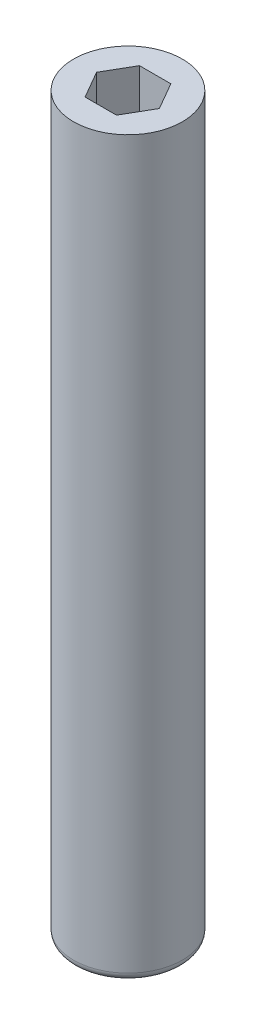
ISO-10303-21;
HEADER;
FILE_DESCRIPTION(('STEP AP214'),'2;1');
FILE_NAME('part.step','',(''),(''),'','','');
FILE_SCHEMA(('AUTOMOTIVE_DESIGN { 1 0 10303 214 1 1 1 1 }'));
ENDSEC;
DATA;
#1=APPLICATION_CONTEXT('core data for automotive mechanical design processes');
#2=APPLICATION_PROTOCOL_DEFINITION('international standard','automotive_design',2000,#1);
#3=PRODUCT_CONTEXT('',#1,'mechanical');
#4=PRODUCT('Part','Part','',(#3));
#5=PRODUCT_RELATED_PRODUCT_CATEGORY('part','',(#4));
#6=PRODUCT_DEFINITION_FORMATION('','',#4);
#7=PRODUCT_DEFINITION_CONTEXT('part definition',#1,'design');
#8=PRODUCT_DEFINITION('design','',#6,#7);
#9=PRODUCT_DEFINITION_SHAPE('','',#8);
#10=(LENGTH_UNIT() NAMED_UNIT(*) SI_UNIT(.MILLI.,.METRE.));
#11=(NAMED_UNIT(*) PLANE_ANGLE_UNIT() SI_UNIT($,.RADIAN.));
#12=(NAMED_UNIT(*) SI_UNIT($,.STERADIAN.) SOLID_ANGLE_UNIT());
#13=UNCERTAINTY_MEASURE_WITH_UNIT(LENGTH_MEASURE(1.E-05),#10,'distance_accuracy_value','');
#14=(GEOMETRIC_REPRESENTATION_CONTEXT(3) GLOBAL_UNCERTAINTY_ASSIGNED_CONTEXT((#13)) GLOBAL_UNIT_ASSIGNED_CONTEXT((#10,
#11,#12)) REPRESENTATION_CONTEXT('',''));
#15=CARTESIAN_POINT('',(0.,0.,0.));
#16=DIRECTION('',(0.,0.,1.));
#17=DIRECTION('',(1.,0.,0.));
#18=AXIS2_PLACEMENT_3D('',#15,#16,#17);
#19=CARTESIAN_POINT('',(0.,68.58,0.));
#20=DIRECTION('',(0.,-1.,0.));
#21=DIRECTION('',(0.,0.,-1.));
#22=AXIS2_PLACEMENT_3D('',#19,#20,#21);
#23=CYLINDRICAL_SURFACE('',#22,5.08);
#24=CARTESIAN_POINT('',(0.,0.761999999999999,0.));
#25=DIRECTION('',(0.,1.,0.));
#26=DIRECTION('',(0.,0.,1.));
#27=AXIS2_PLACEMENT_3D('',#24,#25,#26);
#28=CIRCLE('',#27,5.08);
#29=CARTESIAN_POINT('',(0.,0.761999999999999,5.08));
#30=VERTEX_POINT('',#29);
#31=EDGE_CURVE('E40',#30,#30,#28,.T.);
#32=ORIENTED_EDGE('',*,*,#31,.T.);
#33=EDGE_LOOP('',(#32));
#34=FACE_BOUND('',#33,.T.);
#35=CARTESIAN_POINT('',(0.,68.58,0.));
#36=DIRECTION('',(0.,1.,0.));
#37=DIRECTION('',(0.,0.,1.));
#38=AXIS2_PLACEMENT_3D('',#35,#36,#37);
#39=CIRCLE('',#38,5.08);
#40=CARTESIAN_POINT('',(0.,68.58,5.08));
#41=VERTEX_POINT('',#40);
#42=EDGE_CURVE('E134',#41,#41,#39,.T.);
#43=ORIENTED_EDGE('',*,*,#42,.F.);
#44=EDGE_LOOP('',(#43));
#45=FACE_BOUND('',#44,.T.);
#46=ADVANCED_FACE('F32',(#34,#45),#23,.T.);
#47=CARTESIAN_POINT('',(0.,68.58,0.));
#48=DIRECTION('',(0.,1.,0.));
#49=DIRECTION('',(0.,0.,1.));
#50=AXIS2_PLACEMENT_3D('',#47,#48,#49);
#51=PLANE('',#50);
#52=DIRECTION('',(0.5,0.,0.866025403784439));
#53=VECTOR('',#52,1.);
#54=CARTESIAN_POINT('',(-2.9329393674833,68.58,0.));
#55=LINE('',#54,#53);
#56=CARTESIAN_POINT('',(-2.9329393674833,68.58,0.));
#57=VERTEX_POINT('',#56);
#58=CARTESIAN_POINT('',(-1.46646968374165,68.58,2.54));
#59=VERTEX_POINT('',#58);
#60=EDGE_CURVE('E47',#57,#59,#55,.T.);
#61=ORIENTED_EDGE('',*,*,#60,.F.);
#62=DIRECTION('',(-0.5,0.,0.866025403784439));
#63=VECTOR('',#62,1.);
#64=CARTESIAN_POINT('',(-1.46646968374165,68.58,-2.54));
#65=LINE('',#64,#63);
#66=CARTESIAN_POINT('',(-1.46646968374165,68.58,-2.54));
#67=VERTEX_POINT('',#66);
#68=EDGE_CURVE('E130',#67,#57,#65,.T.);
#69=ORIENTED_EDGE('',*,*,#68,.F.);
#70=DIRECTION('',(-1.,0.,0.));
#71=VECTOR('',#70,1.);
#72=CARTESIAN_POINT('',(1.46646968374165,68.58,-2.54));
#73=LINE('',#72,#71);
#74=CARTESIAN_POINT('',(1.46646968374165,68.58,-2.54));
#75=VERTEX_POINT('',#74);
#76=EDGE_CURVE('E128',#75,#67,#73,.T.);
#77=ORIENTED_EDGE('',*,*,#76,.F.);
#78=DIRECTION('',(-0.5,0.,-0.866025403784439));
#79=VECTOR('',#78,1.);
#80=CARTESIAN_POINT('',(2.9329393674833,68.58,0.));
#81=LINE('',#80,#79);
#82=CARTESIAN_POINT('',(2.9329393674833,68.58,0.));
#83=VERTEX_POINT('',#82);
#84=EDGE_CURVE('E95',#83,#75,#81,.T.);
#85=ORIENTED_EDGE('',*,*,#84,.F.);
#86=DIRECTION('',(0.5,0.,-0.866025403784438));
#87=VECTOR('',#86,1.);
#88=CARTESIAN_POINT('',(1.46646968374165,68.58,2.54));
#89=LINE('',#88,#87);
#90=CARTESIAN_POINT('',(1.46646968374165,68.58,2.54));
#91=VERTEX_POINT('',#90);
#92=EDGE_CURVE('E124',#91,#83,#89,.T.);
#93=ORIENTED_EDGE('',*,*,#92,.F.);
#94=DIRECTION('',(1.,0.,0.));
#95=VECTOR('',#94,1.);
#96=CARTESIAN_POINT('',(-1.46646968374165,68.58,2.54));
#97=LINE('',#96,#95);
#98=EDGE_CURVE('E121',#59,#91,#97,.T.);
#99=ORIENTED_EDGE('',*,*,#98,.F.);
#100=EDGE_LOOP('',(#61,#69,#77,#85,#93,#99));
#101=FACE_BOUND('',#100,.T.);
#102=ORIENTED_EDGE('',*,*,#42,.T.);
#103=EDGE_LOOP('',(#102));
#104=FACE_BOUND('',#103,.T.);
#105=ADVANCED_FACE('F155',(#101,#104),#51,.T.);
#106=CARTESIAN_POINT('',(0.,0.,0.));
#107=DIRECTION('',(0.,1.,0.));
#108=DIRECTION('',(0.,0.,1.));
#109=AXIS2_PLACEMENT_3D('',#106,#107,#108);
#110=PLANE('',#109);
#111=CARTESIAN_POINT('',(0.,0.,0.));
#112=DIRECTION('',(0.,1.,0.));
#113=DIRECTION('',(0.,0.,1.));
#114=AXIS2_PLACEMENT_3D('',#111,#112,#113);
#115=CIRCLE('',#114,4.318);
#116=CARTESIAN_POINT('',(0.,0.,4.318));
#117=VERTEX_POINT('',#116);
#118=EDGE_CURVE('E11',#117,#117,#115,.F.);
#119=ORIENTED_EDGE('',*,*,#118,.T.);
#120=EDGE_LOOP('',(#119));
#121=FACE_BOUND('',#120,.T.);
#122=ADVANCED_FACE('F159',(#121),#110,.F.);
#123=CARTESIAN_POINT('',(-2.9329393674833,63.5,0.));
#124=DIRECTION('',(-0.866025403784439,0.,0.5));
#125=DIRECTION('',(0.5,0.,0.866025403784439));
#126=AXIS2_PLACEMENT_3D('',#123,#124,#125);
#127=PLANE('',#126);
#128=ORIENTED_EDGE('',*,*,#60,.T.);
#129=DIRECTION('',(0.,1.,0.));
#130=VECTOR('',#129,1.);
#131=CARTESIAN_POINT('',(-1.46646968374165,63.5,2.54));
#132=LINE('',#131,#130);
#133=CARTESIAN_POINT('',(-1.46646968374165,63.5,2.54));
#134=VERTEX_POINT('',#133);
#135=EDGE_CURVE('E77',#134,#59,#132,.T.);
#136=ORIENTED_EDGE('',*,*,#135,.F.);
#137=DIRECTION('',(0.5,0.,0.866025403784439));
#138=VECTOR('',#137,1.);
#139=CARTESIAN_POINT('',(-2.9329393674833,63.5,0.));
#140=LINE('',#139,#138);
#141=CARTESIAN_POINT('',(-2.9329393674833,63.5,0.));
#142=VERTEX_POINT('',#141);
#143=EDGE_CURVE('E132',#142,#134,#140,.T.);
#144=ORIENTED_EDGE('',*,*,#143,.F.);
#145=DIRECTION('',(0.,1.,0.));
#146=VECTOR('',#145,1.);
#147=CARTESIAN_POINT('',(-2.9329393674833,63.5,0.));
#148=LINE('',#147,#146);
#149=EDGE_CURVE('E55',#142,#57,#148,.T.);
#150=ORIENTED_EDGE('',*,*,#149,.T.);
#151=EDGE_LOOP('',(#128,#136,#144,#150));
#152=FACE_BOUND('',#151,.T.);
#153=ADVANCED_FACE('F164',(#152),#127,.F.);
#154=CARTESIAN_POINT('',(-1.46646968374165,63.5,-2.54));
#155=DIRECTION('',(-0.866025403784438,0.,-0.5));
#156=DIRECTION('',(-0.5,0.,0.866025403784439));
#157=AXIS2_PLACEMENT_3D('',#154,#155,#156);
#158=PLANE('',#157);
#159=ORIENTED_EDGE('',*,*,#68,.T.);
#160=ORIENTED_EDGE('',*,*,#149,.F.);
#161=DIRECTION('',(-0.5,0.,0.866025403784439));
#162=VECTOR('',#161,1.);
#163=CARTESIAN_POINT('',(-1.46646968374165,63.5,-2.54));
#164=LINE('',#163,#162);
#165=CARTESIAN_POINT('',(-1.46646968374165,63.5,-2.54));
#166=VERTEX_POINT('',#165);
#167=EDGE_CURVE('E107',#166,#142,#164,.T.);
#168=ORIENTED_EDGE('',*,*,#167,.F.);
#169=DIRECTION('',(0.,1.,0.));
#170=VECTOR('',#169,1.);
#171=CARTESIAN_POINT('',(-1.46646968374165,63.5,-2.54));
#172=LINE('',#171,#170);
#173=EDGE_CURVE('E99',#166,#67,#172,.T.);
#174=ORIENTED_EDGE('',*,*,#173,.T.);
#175=EDGE_LOOP('',(#159,#160,#168,#174));
#176=FACE_BOUND('',#175,.T.);
#177=ADVANCED_FACE('F169',(#176),#158,.F.);
#178=CARTESIAN_POINT('',(1.46646968374165,63.5,-2.54));
#179=DIRECTION('',(0.,0.,-1.));
#180=DIRECTION('',(-1.,0.,0.));
#181=AXIS2_PLACEMENT_3D('',#178,#179,#180);
#182=PLANE('',#181);
#183=ORIENTED_EDGE('',*,*,#76,.T.);
#184=ORIENTED_EDGE('',*,*,#173,.F.);
#185=DIRECTION('',(-1.,0.,0.));
#186=VECTOR('',#185,1.);
#187=CARTESIAN_POINT('',(1.46646968374165,63.5,-2.54));
#188=LINE('',#187,#186);
#189=CARTESIAN_POINT('',(1.46646968374165,63.5,-2.54));
#190=VERTEX_POINT('',#189);
#191=EDGE_CURVE('E103',#190,#166,#188,.T.);
#192=ORIENTED_EDGE('',*,*,#191,.F.);
#193=DIRECTION('',(0.,1.,0.));
#194=VECTOR('',#193,1.);
#195=CARTESIAN_POINT('',(1.46646968374165,63.5,-2.54));
#196=LINE('',#195,#194);
#197=EDGE_CURVE('E88',#190,#75,#196,.T.);
#198=ORIENTED_EDGE('',*,*,#197,.T.);
#199=EDGE_LOOP('',(#183,#184,#192,#198));
#200=FACE_BOUND('',#199,.T.);
#201=ADVANCED_FACE('F104',(#200),#182,.F.);
#202=CARTESIAN_POINT('',(2.9329393674833,63.5,0.));
#203=DIRECTION('',(0.866025403784439,0.,-0.5));
#204=DIRECTION('',(-0.5,0.,-0.866025403784439));
#205=AXIS2_PLACEMENT_3D('',#202,#203,#204);
#206=PLANE('',#205);
#207=ORIENTED_EDGE('',*,*,#84,.T.);
#208=ORIENTED_EDGE('',*,*,#197,.F.);
#209=DIRECTION('',(-0.5,0.,-0.866025403784439));
#210=VECTOR('',#209,1.);
#211=CARTESIAN_POINT('',(2.9329393674833,63.5,0.));
#212=LINE('',#211,#210);
#213=CARTESIAN_POINT('',(2.9329393674833,63.5,0.));
#214=VERTEX_POINT('',#213);
#215=EDGE_CURVE('E92',#214,#190,#212,.T.);
#216=ORIENTED_EDGE('',*,*,#215,.F.);
#217=DIRECTION('',(0.,1.,0.));
#218=VECTOR('',#217,1.);
#219=CARTESIAN_POINT('',(2.9329393674833,63.5,0.));
#220=LINE('',#219,#218);
#221=EDGE_CURVE('E100',#214,#83,#220,.T.);
#222=ORIENTED_EDGE('',*,*,#221,.T.);
#223=EDGE_LOOP('',(#207,#208,#216,#222));
#224=FACE_BOUND('',#223,.T.);
#225=ADVANCED_FACE('F90',(#224),#206,.F.);
#226=CARTESIAN_POINT('',(1.46646968374165,63.5,2.54));
#227=DIRECTION('',(0.866025403784438,0.,0.5));
#228=DIRECTION('',(0.5,0.,-0.866025403784438));
#229=AXIS2_PLACEMENT_3D('',#226,#227,#228);
#230=PLANE('',#229);
#231=ORIENTED_EDGE('',*,*,#92,.T.);
#232=ORIENTED_EDGE('',*,*,#221,.F.);
#233=DIRECTION('',(0.5,0.,-0.866025403784438));
#234=VECTOR('',#233,1.);
#235=CARTESIAN_POINT('',(1.46646968374165,63.5,2.54));
#236=LINE('',#235,#234);
#237=CARTESIAN_POINT('',(1.46646968374165,63.5,2.54));
#238=VERTEX_POINT('',#237);
#239=EDGE_CURVE('E113',#238,#214,#236,.T.);
#240=ORIENTED_EDGE('',*,*,#239,.F.);
#241=DIRECTION('',(0.,1.,0.));
#242=VECTOR('',#241,1.);
#243=CARTESIAN_POINT('',(1.46646968374165,63.5,2.54));
#244=LINE('',#243,#242);
#245=EDGE_CURVE('E137',#238,#91,#244,.T.);
#246=ORIENTED_EDGE('',*,*,#245,.T.);
#247=EDGE_LOOP('',(#231,#232,#240,#246));
#248=FACE_BOUND('',#247,.T.);
#249=ADVANCED_FACE('F172',(#248),#230,.F.);
#250=CARTESIAN_POINT('',(-1.46646968374165,63.5,2.54));
#251=DIRECTION('',(0.,0.,1.));
#252=DIRECTION('',(1.,0.,0.));
#253=AXIS2_PLACEMENT_3D('',#250,#251,#252);
#254=PLANE('',#253);
#255=ORIENTED_EDGE('',*,*,#98,.T.);
#256=ORIENTED_EDGE('',*,*,#245,.F.);
#257=DIRECTION('',(1.,0.,0.));
#258=VECTOR('',#257,1.);
#259=CARTESIAN_POINT('',(-1.46646968374165,63.5,2.54));
#260=LINE('',#259,#258);
#261=EDGE_CURVE('E115',#134,#238,#260,.T.);
#262=ORIENTED_EDGE('',*,*,#261,.F.);
#263=ORIENTED_EDGE('',*,*,#135,.T.);
#264=EDGE_LOOP('',(#255,#256,#262,#263));
#265=FACE_BOUND('',#264,.T.);
#266=ADVANCED_FACE('F151',(#265),#254,.F.);
#267=CARTESIAN_POINT('',(0.,63.5,0.));
#268=DIRECTION('',(0.,1.,0.));
#269=DIRECTION('',(0.,0.,1.));
#270=AXIS2_PLACEMENT_3D('',#267,#268,#269);
#271=PLANE('',#270);
#272=ORIENTED_EDGE('',*,*,#143,.T.);
#273=ORIENTED_EDGE('',*,*,#261,.T.);
#274=ORIENTED_EDGE('',*,*,#239,.T.);
#275=ORIENTED_EDGE('',*,*,#215,.T.);
#276=ORIENTED_EDGE('',*,*,#191,.T.);
#277=ORIENTED_EDGE('',*,*,#167,.T.);
#278=EDGE_LOOP('',(#272,#273,#274,#275,#276,#277));
#279=FACE_BOUND('',#278,.T.);
#280=ADVANCED_FACE('F110',(#279),#271,.T.);
#281=CARTESIAN_POINT('',(0.,0.761999999999999,0.));
#282=DIRECTION('',(0.,1.,0.));
#283=DIRECTION('',(0.,0.,1.));
#284=AXIS2_PLACEMENT_3D('',#281,#282,#283);
#285=TOROIDAL_SURFACE('',#284,4.318,0.762);
#286=ORIENTED_EDGE('',*,*,#118,.F.);
#287=EDGE_LOOP('',(#286));
#288=FACE_BOUND('',#287,.T.);
#289=ORIENTED_EDGE('',*,*,#31,.F.);
#290=EDGE_LOOP('',(#289));
#291=FACE_BOUND('',#290,.T.);
#292=ADVANCED_FACE('F34',(#288,#291),#285,.T.);
#293=CLOSED_SHELL('',(#46,#105,#122,#153,#177,#201,#225,#249,#266,#280,#292));
#294=MANIFOLD_SOLID_BREP('B2',#293);
#295=ADVANCED_BREP_SHAPE_REPRESENTATION('',(#18,#294),#14);
#296=SHAPE_DEFINITION_REPRESENTATION(#9,#295);
ENDSEC;
END-ISO-10303-21;
